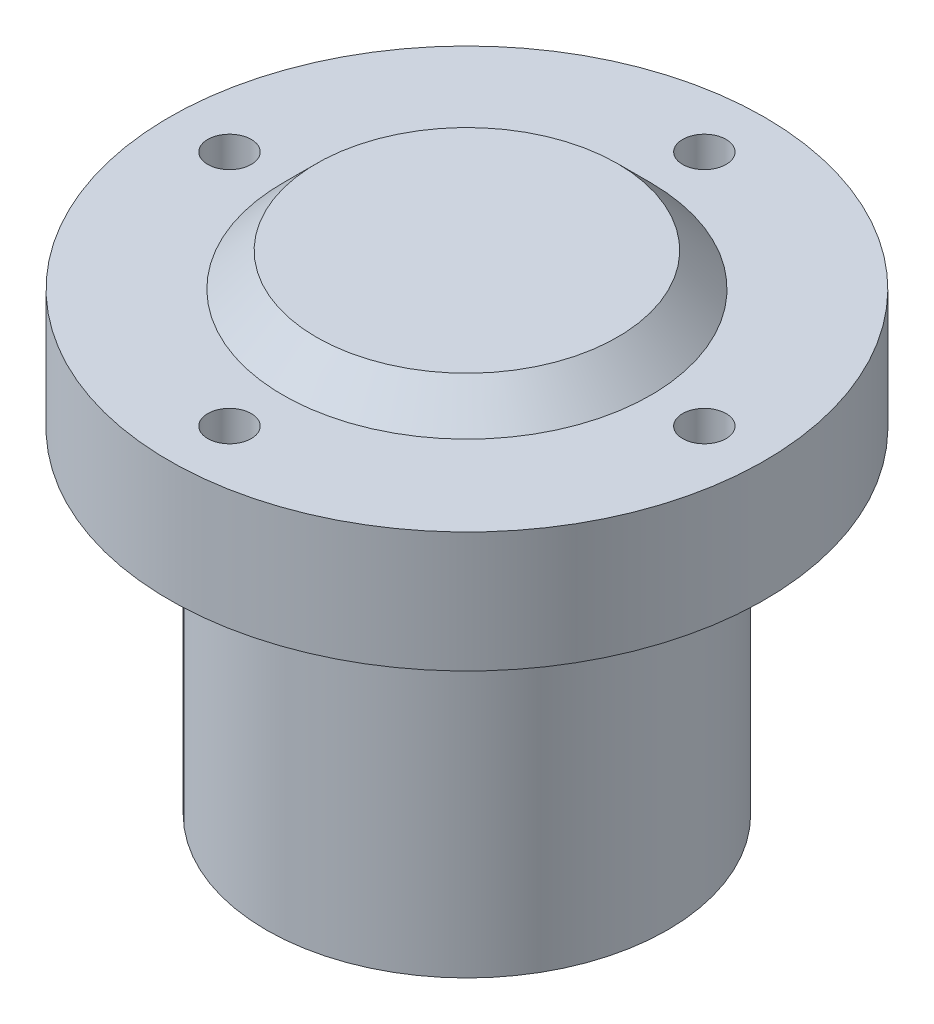
ISO-10303-21;
HEADER;
FILE_DESCRIPTION(('STEP AP214'),'2;1');
FILE_NAME('part.step','',(''),(''),'','','');
FILE_SCHEMA(('AUTOMOTIVE_DESIGN { 1 0 10303 214 1 1 1 1 }'));
ENDSEC;
DATA;
#1=APPLICATION_CONTEXT('core data for automotive mechanical design processes');
#2=APPLICATION_PROTOCOL_DEFINITION('international standard','automotive_design',2000,#1);
#3=PRODUCT_CONTEXT('',#1,'mechanical');
#4=PRODUCT('Part','Part','',(#3));
#5=PRODUCT_RELATED_PRODUCT_CATEGORY('part','',(#4));
#6=PRODUCT_DEFINITION_FORMATION('','',#4);
#7=PRODUCT_DEFINITION_CONTEXT('part definition',#1,'design');
#8=PRODUCT_DEFINITION('design','',#6,#7);
#9=PRODUCT_DEFINITION_SHAPE('','',#8);
#10=(LENGTH_UNIT() NAMED_UNIT(*) SI_UNIT(.MILLI.,.METRE.));
#11=(NAMED_UNIT(*) PLANE_ANGLE_UNIT() SI_UNIT($,.RADIAN.));
#12=(NAMED_UNIT(*) SI_UNIT($,.STERADIAN.) SOLID_ANGLE_UNIT());
#13=UNCERTAINTY_MEASURE_WITH_UNIT(LENGTH_MEASURE(1.E-05),#10,'distance_accuracy_value','');
#14=(GEOMETRIC_REPRESENTATION_CONTEXT(3) GLOBAL_UNCERTAINTY_ASSIGNED_CONTEXT((#13)) GLOBAL_UNIT_ASSIGNED_CONTEXT((#10,
#11,#12)) REPRESENTATION_CONTEXT('',''));
#15=CARTESIAN_POINT('',(0.,0.,0.));
#16=DIRECTION('',(0.,0.,1.));
#17=DIRECTION('',(1.,0.,0.));
#18=AXIS2_PLACEMENT_3D('',#15,#16,#17);
#19=CARTESIAN_POINT('',(0.,73.,0.));
#20=DIRECTION('',(0.,1.,0.));
#21=DIRECTION('',(0.,0.,1.));
#22=AXIS2_PLACEMENT_3D('',#19,#20,#21);
#23=PLANE('',#22);
#24=CARTESIAN_POINT('',(0.,73.,0.));
#25=DIRECTION('',(0.,-1.,0.));
#26=DIRECTION('',(0.,0.,-1.));
#27=AXIS2_PLACEMENT_3D('',#24,#25,#26);
#28=CIRCLE('',#27,22.5);
#29=CARTESIAN_POINT('',(0.,73.,-22.5));
#30=VERTEX_POINT('',#29);
#31=EDGE_CURVE('E10',#30,#30,#28,.T.);
#32=ORIENTED_EDGE('',*,*,#31,.F.);
#33=EDGE_LOOP('',(#32));
#34=FACE_BOUND('',#33,.T.);
#35=ADVANCED_FACE('F35',(#34),#23,.T.);
#36=CARTESIAN_POINT('',(0.,68.,0.));
#37=DIRECTION('',(0.,-1.,0.));
#38=DIRECTION('',(0.,0.,-1.));
#39=AXIS2_PLACEMENT_3D('',#36,#37,#38);
#40=CONICAL_SURFACE('',#39,27.5,0.785398163397447);
#41=ORIENTED_EDGE('',*,*,#31,.T.);
#42=EDGE_LOOP('',(#41));
#43=FACE_BOUND('',#42,.T.);
#44=CARTESIAN_POINT('',(0.,68.,0.));
#45=DIRECTION('',(0.,-1.,0.));
#46=DIRECTION('',(0.,0.,-1.));
#47=AXIS2_PLACEMENT_3D('',#44,#45,#46);
#48=CIRCLE('',#47,27.5);
#49=CARTESIAN_POINT('',(0.,68.,-27.5));
#50=VERTEX_POINT('',#49);
#51=EDGE_CURVE('E42',#50,#50,#48,.T.);
#52=ORIENTED_EDGE('',*,*,#51,.F.);
#53=EDGE_LOOP('',(#52));
#54=FACE_BOUND('',#53,.T.);
#55=ADVANCED_FACE('F86',(#43,#54),#40,.T.);
#56=CARTESIAN_POINT('',(27.5,68.,0.));
#57=DIRECTION('',(0.,1.,0.));
#58=DIRECTION('',(0.,0.,1.));
#59=AXIS2_PLACEMENT_3D('',#56,#57,#58);
#60=PLANE('',#59);
#61=CARTESIAN_POINT('',(0.,68.,-35.5));
#62=DIRECTION('',(0.,1.,0.));
#63=DIRECTION('',(0.,0.,1.));
#64=AXIS2_PLACEMENT_3D('',#61,#62,#63);
#65=CIRCLE('',#64,3.25);
#66=CARTESIAN_POINT('',(0.,68.,-32.25));
#67=VERTEX_POINT('',#66);
#68=EDGE_CURVE('E55',#67,#67,#65,.T.);
#69=ORIENTED_EDGE('',*,*,#68,.F.);
#70=EDGE_LOOP('',(#69));
#71=FACE_BOUND('',#70,.T.);
#72=CARTESIAN_POINT('',(35.5,68.,0.));
#73=DIRECTION('',(0.,1.,0.));
#74=DIRECTION('',(0.,0.,1.));
#75=AXIS2_PLACEMENT_3D('',#72,#73,#74);
#76=CIRCLE('',#75,3.25);
#77=CARTESIAN_POINT('',(35.5,68.,3.25));
#78=VERTEX_POINT('',#77);
#79=EDGE_CURVE('E187',#78,#78,#76,.T.);
#80=ORIENTED_EDGE('',*,*,#79,.F.);
#81=EDGE_LOOP('',(#80));
#82=FACE_BOUND('',#81,.T.);
#83=CARTESIAN_POINT('',(0.,68.,35.5));
#84=DIRECTION('',(0.,1.,0.));
#85=DIRECTION('',(0.,0.,1.));
#86=AXIS2_PLACEMENT_3D('',#83,#84,#85);
#87=CIRCLE('',#86,3.25);
#88=CARTESIAN_POINT('',(0.,68.,38.75));
#89=VERTEX_POINT('',#88);
#90=EDGE_CURVE('E190',#89,#89,#87,.T.);
#91=ORIENTED_EDGE('',*,*,#90,.F.);
#92=EDGE_LOOP('',(#91));
#93=FACE_BOUND('',#92,.T.);
#94=CARTESIAN_POINT('',(-35.5,68.,0.));
#95=DIRECTION('',(0.,1.,0.));
#96=DIRECTION('',(0.,0.,1.));
#97=AXIS2_PLACEMENT_3D('',#94,#95,#96);
#98=CIRCLE('',#97,3.25);
#99=CARTESIAN_POINT('',(-35.5,68.,3.25));
#100=VERTEX_POINT('',#99);
#101=EDGE_CURVE('E74',#100,#100,#98,.T.);
#102=ORIENTED_EDGE('',*,*,#101,.F.);
#103=EDGE_LOOP('',(#102));
#104=FACE_BOUND('',#103,.T.);
#105=ORIENTED_EDGE('',*,*,#51,.T.);
#106=EDGE_LOOP('',(#105));
#107=FACE_BOUND('',#106,.T.);
#108=CARTESIAN_POINT('',(0.,68.,0.));
#109=DIRECTION('',(0.,-1.,0.));
#110=DIRECTION('',(0.,0.,-1.));
#111=AXIS2_PLACEMENT_3D('',#108,#109,#110);
#112=CIRCLE('',#111,44.5);
#113=CARTESIAN_POINT('',(0.,68.,-44.5));
#114=VERTEX_POINT('',#113);
#115=EDGE_CURVE('E47',#114,#114,#112,.T.);
#116=ORIENTED_EDGE('',*,*,#115,.F.);
#117=EDGE_LOOP('',(#116));
#118=FACE_BOUND('',#117,.T.);
#119=ADVANCED_FACE('F84',(#71,#82,#93,#104,#107,#118),#60,.T.);
#120=CARTESIAN_POINT('',(0.,0.,0.));
#121=DIRECTION('',(0.,-1.,0.));
#122=DIRECTION('',(0.,0.,-1.));
#123=AXIS2_PLACEMENT_3D('',#120,#121,#122);
#124=CYLINDRICAL_SURFACE('',#123,44.5);
#125=ORIENTED_EDGE('',*,*,#115,.T.);
#126=EDGE_LOOP('',(#125));
#127=FACE_BOUND('',#126,.T.);
#128=CARTESIAN_POINT('',(0.,50.,0.));
#129=DIRECTION('',(0.,-1.,0.));
#130=DIRECTION('',(0.,0.,-1.));
#131=AXIS2_PLACEMENT_3D('',#128,#129,#130);
#132=CIRCLE('',#131,44.5);
#133=CARTESIAN_POINT('',(0.,50.,-44.5));
#134=VERTEX_POINT('',#133);
#135=EDGE_CURVE('E71',#134,#134,#132,.T.);
#136=ORIENTED_EDGE('',*,*,#135,.F.);
#137=EDGE_LOOP('',(#136));
#138=FACE_BOUND('',#137,.T.);
#139=ADVANCED_FACE('F81',(#127,#138),#124,.T.);
#140=CARTESIAN_POINT('',(44.5,50.,0.));
#141=DIRECTION('',(0.,-1.,0.));
#142=DIRECTION('',(0.,0.,-1.));
#143=AXIS2_PLACEMENT_3D('',#140,#141,#142);
#144=PLANE('',#143);
#145=CARTESIAN_POINT('',(0.,50.,-35.5));
#146=DIRECTION('',(0.,-1.,0.));
#147=DIRECTION('',(0.,0.,-1.));
#148=AXIS2_PLACEMENT_3D('',#145,#146,#147);
#149=CIRCLE('',#148,3.25);
#150=CARTESIAN_POINT('',(0.,50.,-38.75));
#151=VERTEX_POINT('',#150);
#152=EDGE_CURVE('E38',#151,#151,#149,.T.);
#153=ORIENTED_EDGE('',*,*,#152,.F.);
#154=EDGE_LOOP('',(#153));
#155=FACE_BOUND('',#154,.T.);
#156=CARTESIAN_POINT('',(35.5,50.,0.));
#157=DIRECTION('',(0.,-1.,0.));
#158=DIRECTION('',(0.,0.,-1.));
#159=AXIS2_PLACEMENT_3D('',#156,#157,#158);
#160=CIRCLE('',#159,3.25);
#161=CARTESIAN_POINT('',(35.5,50.,-3.25));
#162=VERTEX_POINT('',#161);
#163=EDGE_CURVE('E57',#162,#162,#160,.T.);
#164=ORIENTED_EDGE('',*,*,#163,.F.);
#165=EDGE_LOOP('',(#164));
#166=FACE_BOUND('',#165,.T.);
#167=CARTESIAN_POINT('',(0.,50.,35.5));
#168=DIRECTION('',(0.,-1.,0.));
#169=DIRECTION('',(0.,0.,-1.));
#170=AXIS2_PLACEMENT_3D('',#167,#168,#169);
#171=CIRCLE('',#170,3.25);
#172=CARTESIAN_POINT('',(0.,50.,32.25));
#173=VERTEX_POINT('',#172);
#174=EDGE_CURVE('E54',#173,#173,#171,.T.);
#175=ORIENTED_EDGE('',*,*,#174,.F.);
#176=EDGE_LOOP('',(#175));
#177=FACE_BOUND('',#176,.T.);
#178=CARTESIAN_POINT('',(-35.5,50.,0.));
#179=DIRECTION('',(0.,-1.,0.));
#180=DIRECTION('',(0.,0.,-1.));
#181=AXIS2_PLACEMENT_3D('',#178,#179,#180);
#182=CIRCLE('',#181,3.25);
#183=CARTESIAN_POINT('',(-35.5,50.,-3.25));
#184=VERTEX_POINT('',#183);
#185=EDGE_CURVE('E51',#184,#184,#182,.T.);
#186=ORIENTED_EDGE('',*,*,#185,.F.);
#187=EDGE_LOOP('',(#186));
#188=FACE_BOUND('',#187,.T.);
#189=ORIENTED_EDGE('',*,*,#135,.T.);
#190=EDGE_LOOP('',(#189));
#191=FACE_BOUND('',#190,.T.);
#192=CARTESIAN_POINT('',(0.,50.,0.));
#193=DIRECTION('',(0.,-1.,0.));
#194=DIRECTION('',(0.,0.,-1.));
#195=AXIS2_PLACEMENT_3D('',#192,#193,#194);
#196=CIRCLE('',#195,30.);
#197=CARTESIAN_POINT('',(0.,50.,-30.));
#198=VERTEX_POINT('',#197);
#199=EDGE_CURVE('E66',#198,#198,#196,.T.);
#200=ORIENTED_EDGE('',*,*,#199,.F.);
#201=EDGE_LOOP('',(#200));
#202=FACE_BOUND('',#201,.T.);
#203=ADVANCED_FACE('F93',(#155,#166,#177,#188,#191,#202),#144,.T.);
#204=CARTESIAN_POINT('',(0.,0.,0.));
#205=DIRECTION('',(0.,-1.,0.));
#206=DIRECTION('',(0.,0.,-1.));
#207=AXIS2_PLACEMENT_3D('',#204,#205,#206);
#208=CYLINDRICAL_SURFACE('',#207,30.);
#209=ORIENTED_EDGE('',*,*,#199,.T.);
#210=EDGE_LOOP('',(#209));
#211=FACE_BOUND('',#210,.T.);
#212=CARTESIAN_POINT('',(0.,0.,0.));
#213=DIRECTION('',(0.,-1.,0.));
#214=DIRECTION('',(0.,0.,-1.));
#215=AXIS2_PLACEMENT_3D('',#212,#213,#214);
#216=CIRCLE('',#215,30.);
#217=CARTESIAN_POINT('',(0.,0.,-30.));
#218=VERTEX_POINT('',#217);
#219=EDGE_CURVE('E62',#218,#218,#216,.T.);
#220=ORIENTED_EDGE('',*,*,#219,.F.);
#221=EDGE_LOOP('',(#220));
#222=FACE_BOUND('',#221,.T.);
#223=ADVANCED_FACE('F119',(#211,#222),#208,.T.);
#224=CARTESIAN_POINT('',(30.,0.,0.));
#225=DIRECTION('',(0.,-1.,0.));
#226=DIRECTION('',(0.,0.,-1.));
#227=AXIS2_PLACEMENT_3D('',#224,#225,#226);
#228=PLANE('',#227);
#229=ORIENTED_EDGE('',*,*,#219,.T.);
#230=EDGE_LOOP('',(#229));
#231=FACE_BOUND('',#230,.T.);
#232=ADVANCED_FACE('F124',(#231),#228,.T.);
#233=CARTESIAN_POINT('',(-35.5,38.,0.));
#234=DIRECTION('',(0.,1.,0.));
#235=DIRECTION('',(0.,0.,1.));
#236=AXIS2_PLACEMENT_3D('',#233,#234,#235);
#237=CYLINDRICAL_SURFACE('',#236,3.25);
#238=ORIENTED_EDGE('',*,*,#185,.T.);
#239=EDGE_LOOP('',(#238));
#240=FACE_BOUND('',#239,.T.);
#241=ORIENTED_EDGE('',*,*,#101,.T.);
#242=EDGE_LOOP('',(#241));
#243=FACE_BOUND('',#242,.T.);
#244=ADVANCED_FACE('F133',(#240,#243),#237,.F.);
#245=CARTESIAN_POINT('',(0.,38.,35.5));
#246=DIRECTION('',(0.,1.,0.));
#247=DIRECTION('',(0.,0.,1.));
#248=AXIS2_PLACEMENT_3D('',#245,#246,#247);
#249=CYLINDRICAL_SURFACE('',#248,3.25);
#250=ORIENTED_EDGE('',*,*,#174,.T.);
#251=EDGE_LOOP('',(#250));
#252=FACE_BOUND('',#251,.T.);
#253=ORIENTED_EDGE('',*,*,#90,.T.);
#254=EDGE_LOOP('',(#253));
#255=FACE_BOUND('',#254,.T.);
#256=ADVANCED_FACE('F153',(#252,#255),#249,.F.);
#257=CARTESIAN_POINT('',(35.5,38.,0.));
#258=DIRECTION('',(0.,1.,0.));
#259=DIRECTION('',(0.,0.,1.));
#260=AXIS2_PLACEMENT_3D('',#257,#258,#259);
#261=CYLINDRICAL_SURFACE('',#260,3.25);
#262=ORIENTED_EDGE('',*,*,#163,.T.);
#263=EDGE_LOOP('',(#262));
#264=FACE_BOUND('',#263,.T.);
#265=ORIENTED_EDGE('',*,*,#79,.T.);
#266=EDGE_LOOP('',(#265));
#267=FACE_BOUND('',#266,.T.);
#268=ADVANCED_FACE('F163',(#264,#267),#261,.F.);
#269=CARTESIAN_POINT('',(0.,38.,-35.5));
#270=DIRECTION('',(0.,1.,0.));
#271=DIRECTION('',(0.,0.,1.));
#272=AXIS2_PLACEMENT_3D('',#269,#270,#271);
#273=CYLINDRICAL_SURFACE('',#272,3.25);
#274=ORIENTED_EDGE('',*,*,#152,.T.);
#275=EDGE_LOOP('',(#274));
#276=FACE_BOUND('',#275,.T.);
#277=ORIENTED_EDGE('',*,*,#68,.T.);
#278=EDGE_LOOP('',(#277));
#279=FACE_BOUND('',#278,.T.);
#280=ADVANCED_FACE('F173',(#276,#279),#273,.F.);
#281=CLOSED_SHELL('',(#35,#55,#119,#139,#203,#223,#232,#244,#256,#268,#280));
#282=MANIFOLD_SOLID_BREP('B2',#281);
#283=ADVANCED_BREP_SHAPE_REPRESENTATION('',(#18,#282),#14);
#284=SHAPE_DEFINITION_REPRESENTATION(#9,#283);
ENDSEC;
END-ISO-10303-21;
